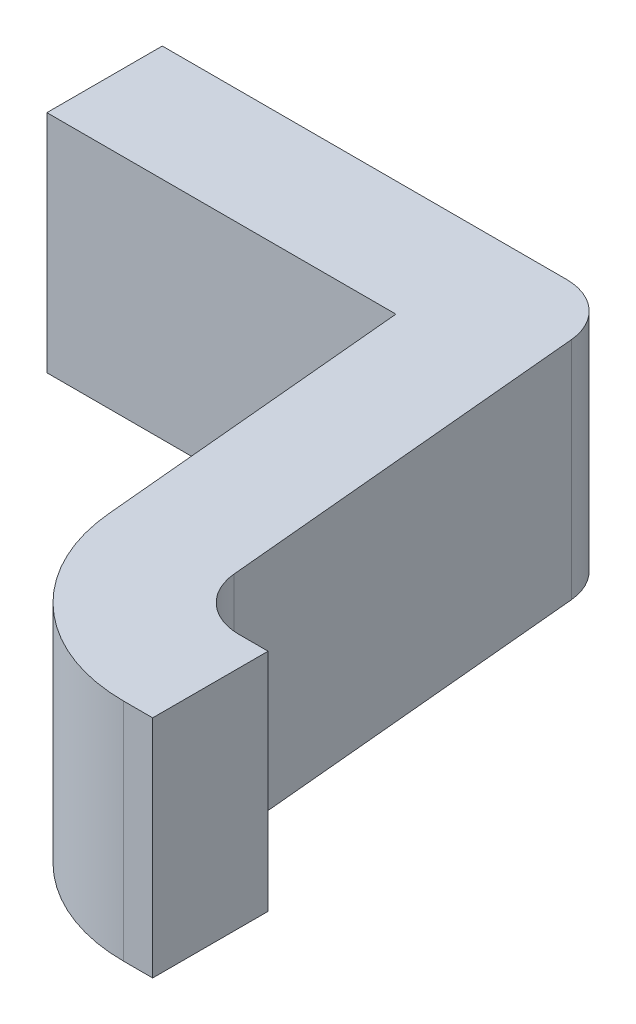
ISO-10303-21;
HEADER;
FILE_DESCRIPTION(('STEP AP214'),'2;1');
FILE_NAME('part.step','',(''),(''),'','','');
FILE_SCHEMA(('AUTOMOTIVE_DESIGN { 1 0 10303 214 1 1 1 1 }'));
ENDSEC;
DATA;
#1=APPLICATION_CONTEXT('core data for automotive mechanical design processes');
#2=APPLICATION_PROTOCOL_DEFINITION('international standard','automotive_design',2000,#1);
#3=PRODUCT_CONTEXT('',#1,'mechanical');
#4=PRODUCT('Part','Part','',(#3));
#5=PRODUCT_RELATED_PRODUCT_CATEGORY('part','',(#4));
#6=PRODUCT_DEFINITION_FORMATION('','',#4);
#7=PRODUCT_DEFINITION_CONTEXT('part definition',#1,'design');
#8=PRODUCT_DEFINITION('design','',#6,#7);
#9=PRODUCT_DEFINITION_SHAPE('','',#8);
#10=(LENGTH_UNIT() NAMED_UNIT(*) SI_UNIT(.MILLI.,.METRE.));
#11=(NAMED_UNIT(*) PLANE_ANGLE_UNIT() SI_UNIT($,.RADIAN.));
#12=(NAMED_UNIT(*) SI_UNIT($,.STERADIAN.) SOLID_ANGLE_UNIT());
#13=UNCERTAINTY_MEASURE_WITH_UNIT(LENGTH_MEASURE(1.E-05),#10,'distance_accuracy_value','');
#14=(GEOMETRIC_REPRESENTATION_CONTEXT(3) GLOBAL_UNCERTAINTY_ASSIGNED_CONTEXT((#13)) GLOBAL_UNIT_ASSIGNED_CONTEXT((#10,
#11,#12)) REPRESENTATION_CONTEXT('',''));
#15=CARTESIAN_POINT('',(0.,0.,0.));
#16=DIRECTION('',(0.,0.,1.));
#17=DIRECTION('',(1.,0.,0.));
#18=AXIS2_PLACEMENT_3D('',#15,#16,#17);
#19=CARTESIAN_POINT('',(-2.264576381953,0.840000000000001,0.21));
#20=DIRECTION('',(0.,0.,-1.));
#21=DIRECTION('',(0.,-1.,0.));
#22=AXIS2_PLACEMENT_3D('',#19,#20,#21);
#23=PLANE('',#22);
#24=DIRECTION('',(0.,1.,0.));
#25=VECTOR('',#24,1.);
#26=CARTESIAN_POINT('',(-2.364887047388,0.84,0.21));
#27=LINE('',#26,#25);
#28=CARTESIAN_POINT('',(-2.364887047388,0.429999999999999,0.21));
#29=VERTEX_POINT('',#28);
#30=CARTESIAN_POINT('',(-2.364887047388,0.84,0.21));
#31=VERTEX_POINT('',#30);
#32=EDGE_CURVE('E11',#29,#31,#27,.T.);
#33=ORIENTED_EDGE('',*,*,#32,.T.);
#34=DIRECTION('',(-1.,0.,0.));
#35=VECTOR('',#34,1.);
#36=CARTESIAN_POINT('',(-2.264576381953,0.84,0.21));
#37=LINE('',#36,#35);
#38=CARTESIAN_POINT('',(-3.,0.84,0.21));
#39=VERTEX_POINT('',#38);
#40=EDGE_CURVE('E24',#31,#39,#37,.T.);
#41=ORIENTED_EDGE('',*,*,#40,.T.);
#42=DIRECTION('',(0.,-1.,0.));
#43=VECTOR('',#42,1.);
#44=CARTESIAN_POINT('',(-3.,0.84,0.21));
#45=LINE('',#44,#43);
#46=CARTESIAN_POINT('',(-3.,0.429999999999999,0.21));
#47=VERTEX_POINT('',#46);
#48=EDGE_CURVE('E187',#39,#47,#45,.T.);
#49=ORIENTED_EDGE('',*,*,#48,.T.);
#50=DIRECTION('',(-1.,0.,0.));
#51=VECTOR('',#50,1.);
#52=CARTESIAN_POINT('',(-2.264576381953,0.429999999999999,0.21));
#53=LINE('',#52,#51);
#54=EDGE_CURVE('E184',#29,#47,#53,.T.);
#55=ORIENTED_EDGE('',*,*,#54,.F.);
#56=EDGE_LOOP('',(#33,#41,#49,#55));
#57=FACE_BOUND('',#56,.T.);
#58=ADVANCED_FACE('F17',(#57),#23,.F.);
#59=CARTESIAN_POINT('',(-2.264576381953,0.429999999999999,0.));
#60=DIRECTION('',(0.,0.,1.));
#61=DIRECTION('',(0.,1.,0.));
#62=AXIS2_PLACEMENT_3D('',#59,#60,#61);
#63=PLANE('',#62);
#64=DIRECTION('',(0.,1.,0.));
#65=VECTOR('',#64,1.);
#66=CARTESIAN_POINT('',(-2.264576381953,0.429999999999999,0.));
#67=LINE('',#66,#65);
#68=CARTESIAN_POINT('',(-2.264576381953,0.429999999999999,0.));
#69=VERTEX_POINT('',#68);
#70=CARTESIAN_POINT('',(-2.264576381953,0.84,0.));
#71=VERTEX_POINT('',#70);
#72=EDGE_CURVE('E182',#69,#71,#67,.T.);
#73=ORIENTED_EDGE('',*,*,#72,.F.);
#74=DIRECTION('',(-1.,0.,0.));
#75=VECTOR('',#74,1.);
#76=CARTESIAN_POINT('',(-2.264576381953,0.429999999999999,0.));
#77=LINE('',#76,#75);
#78=CARTESIAN_POINT('',(-3.,0.429999999999999,0.));
#79=VERTEX_POINT('',#78);
#80=EDGE_CURVE('E180',#69,#79,#77,.T.);
#81=ORIENTED_EDGE('',*,*,#80,.T.);
#82=DIRECTION('',(0.,1.,0.));
#83=VECTOR('',#82,1.);
#84=CARTESIAN_POINT('',(-3.,0.429999999999999,0.));
#85=LINE('',#84,#83);
#86=CARTESIAN_POINT('',(-3.,0.84,0.));
#87=VERTEX_POINT('',#86);
#88=EDGE_CURVE('E178',#79,#87,#85,.T.);
#89=ORIENTED_EDGE('',*,*,#88,.T.);
#90=DIRECTION('',(-1.,0.,0.));
#91=VECTOR('',#90,1.);
#92=CARTESIAN_POINT('',(-2.264576381953,0.84,0.));
#93=LINE('',#92,#91);
#94=EDGE_CURVE('E175',#71,#87,#93,.T.);
#95=ORIENTED_EDGE('',*,*,#94,.F.);
#96=EDGE_LOOP('',(#73,#81,#89,#95));
#97=FACE_BOUND('',#96,.T.);
#98=ADVANCED_FACE('F198',(#97),#63,.F.);
#99=CARTESIAN_POINT('',(-3.,0.635,0.105));
#100=DIRECTION('',(1.,0.,0.));
#101=DIRECTION('',(0.,0.,-1.));
#102=AXIS2_PLACEMENT_3D('',#99,#100,#101);
#103=PLANE('',#102);
#104=ORIENTED_EDGE('',*,*,#88,.F.);
#105=DIRECTION('',(0.,0.,-1.));
#106=VECTOR('',#105,1.);
#107=CARTESIAN_POINT('',(-3.,0.429999999999999,0.21));
#108=LINE('',#107,#106);
#109=EDGE_CURVE('E172',#47,#79,#108,.T.);
#110=ORIENTED_EDGE('',*,*,#109,.F.);
#111=ORIENTED_EDGE('',*,*,#48,.F.);
#112=DIRECTION('',(0.,0.,1.));
#113=VECTOR('',#112,1.);
#114=CARTESIAN_POINT('',(-3.,0.84,0.));
#115=LINE('',#114,#113);
#116=EDGE_CURVE('E169',#87,#39,#115,.T.);
#117=ORIENTED_EDGE('',*,*,#116,.F.);
#118=EDGE_LOOP('',(#104,#110,#111,#117));
#119=FACE_BOUND('',#118,.T.);
#120=ADVANCED_FACE('F194',(#119),#103,.F.);
#121=CARTESIAN_POINT('',(-2.311699392514,0.840000000000001,0.786003848005723));
#122=DIRECTION('',(0.995763819525196,0.,-0.091947896792656));
#123=DIRECTION('',(0.,-1.,0.));
#124=AXIS2_PLACEMENT_3D('',#121,#122,#123);
#125=PLANE('',#124);
#126=ORIENTED_EDGE('',*,*,#32,.F.);
#127=DIRECTION('',(-0.091947896792656,0.,-0.995763819525196));
#128=VECTOR('',#127,1.);
#129=CARTESIAN_POINT('',(-2.311699392514,0.429999999999999,0.786003848005723));
#130=LINE('',#129,#128);
#131=CARTESIAN_POINT('',(-2.311699392514,0.429999999999999,0.786003848005723));
#132=VERTEX_POINT('',#131);
#133=EDGE_CURVE('E166',#132,#29,#130,.T.);
#134=ORIENTED_EDGE('',*,*,#133,.F.);
#135=DIRECTION('',(0.,-1.,0.));
#136=VECTOR('',#135,1.);
#137=CARTESIAN_POINT('',(-2.311699392514,0.84,0.786003848005723));
#138=LINE('',#137,#136);
#139=CARTESIAN_POINT('',(-2.311699392514,0.84,0.786003848005723));
#140=VERTEX_POINT('',#139);
#141=EDGE_CURVE('E163',#140,#132,#138,.T.);
#142=ORIENTED_EDGE('',*,*,#141,.F.);
#143=DIRECTION('',(-0.091947896792656,0.,-0.995763819525196));
#144=VECTOR('',#143,1.);
#145=CARTESIAN_POINT('',(-2.311699392514,0.84,0.786003848005723));
#146=LINE('',#145,#144);
#147=EDGE_CURVE('E161',#140,#31,#146,.T.);
#148=ORIENTED_EDGE('',*,*,#147,.T.);
#149=EDGE_LOOP('',(#126,#134,#142,#148));
#150=FACE_BOUND('',#149,.T.);
#151=ADVANCED_FACE('F204',(#150),#125,.F.);
#152=CARTESIAN_POINT('',(-2.264576381953,0.635,0.1));
#153=DIRECTION('',(0.,1.,0.));
#154=DIRECTION('',(0.,0.,1.));
#155=AXIS2_PLACEMENT_3D('',#152,#153,#154);
#156=CYLINDRICAL_SURFACE('',#155,0.1);
#157=DIRECTION('',(0.,1.,0.));
#158=VECTOR('',#157,1.);
#159=CARTESIAN_POINT('',(-2.165,0.429999999999999,0.0908052103207345));
#160=LINE('',#159,#158);
#161=CARTESIAN_POINT('',(-2.165,0.429999999999999,0.0908052103207343));
#162=VERTEX_POINT('',#161);
#163=CARTESIAN_POINT('',(-2.165,0.84,0.0908052103207343));
#164=VERTEX_POINT('',#163);
#165=EDGE_CURVE('E159',#162,#164,#160,.T.);
#166=ORIENTED_EDGE('',*,*,#165,.F.);
#167=CARTESIAN_POINT('',(-2.264576381953,0.429999999999999,0.1));
#168=DIRECTION('',(0.,1.,0.));
#169=DIRECTION('',(0.995763819525196,0.,-0.091947896792659));
#170=AXIS2_PLACEMENT_3D('',#167,#168,#169);
#171=CIRCLE('',#170,0.1);
#172=EDGE_CURVE('E156',#162,#69,#171,.T.);
#173=ORIENTED_EDGE('',*,*,#172,.T.);
#174=ORIENTED_EDGE('',*,*,#72,.T.);
#175=CARTESIAN_POINT('',(-2.264576381953,0.840000000000001,0.1));
#176=DIRECTION('',(0.,1.,0.));
#177=DIRECTION('',(0.995763819525196,0.,-0.091947896792659));
#178=AXIS2_PLACEMENT_3D('',#175,#176,#177);
#179=CIRCLE('',#178,0.100000000000001);
#180=EDGE_CURVE('E153',#164,#71,#179,.T.);
#181=ORIENTED_EDGE('',*,*,#180,.F.);
#182=EDGE_LOOP('',(#166,#173,#174,#181));
#183=FACE_BOUND('',#182,.T.);
#184=ADVANCED_FACE('F217',(#183),#156,.T.);
#185=CARTESIAN_POINT('',(-2.102588990414,0.429999999999999,0.766694789679267));
#186=DIRECTION('',(-0.995763819525196,0.,0.091947896792656));
#187=DIRECTION('',(0.,1.,0.));
#188=AXIS2_PLACEMENT_3D('',#185,#186,#187);
#189=PLANE('',#188);
#190=DIRECTION('',(0.,1.,0.));
#191=VECTOR('',#190,1.);
#192=CARTESIAN_POINT('',(-2.102588990414,0.429999999999999,0.766694789679267));
#193=LINE('',#192,#191);
#194=CARTESIAN_POINT('',(-2.102588990414,0.429999999999999,0.766694789679267));
#195=VERTEX_POINT('',#194);
#196=CARTESIAN_POINT('',(-2.102588990414,0.84,0.766694789679267));
#197=VERTEX_POINT('',#196);
#198=EDGE_CURVE('E151',#195,#197,#193,.T.);
#199=ORIENTED_EDGE('',*,*,#198,.F.);
#200=DIRECTION('',(-0.091947896792656,0.,-0.995763819525196));
#201=VECTOR('',#200,1.);
#202=CARTESIAN_POINT('',(-2.102588990414,0.429999999999999,0.766694789679267));
#203=LINE('',#202,#201);
#204=EDGE_CURVE('E148',#195,#162,#203,.T.);
#205=ORIENTED_EDGE('',*,*,#204,.T.);
#206=ORIENTED_EDGE('',*,*,#165,.T.);
#207=DIRECTION('',(-0.091947896792656,0.,-0.995763819525196));
#208=VECTOR('',#207,1.);
#209=CARTESIAN_POINT('',(-2.102588990414,0.84,0.766694789679267));
#210=LINE('',#209,#208);
#211=EDGE_CURVE('E145',#197,#164,#210,.T.);
#212=ORIENTED_EDGE('',*,*,#211,.F.);
#213=EDGE_LOOP('',(#199,#205,#206,#212));
#214=FACE_BOUND('',#213,.T.);
#215=ADVANCED_FACE('F215',(#214),#189,.F.);
#216=CARTESIAN_POINT('',(-2.003012608461,0.635,0.7575));
#217=DIRECTION('',(0.,-1.,0.));
#218=DIRECTION('',(0.,0.,1.));
#219=AXIS2_PLACEMENT_3D('',#216,#217,#218);
#220=CYLINDRICAL_SURFACE('',#219,0.309999999999999);
#221=DIRECTION('',(0.,-1.,0.));
#222=VECTOR('',#221,1.);
#223=CARTESIAN_POINT('',(-2.003012608461,0.84,1.0675));
#224=LINE('',#223,#222);
#225=CARTESIAN_POINT('',(-2.003012608461,0.84,1.0675));
#226=VERTEX_POINT('',#225);
#227=CARTESIAN_POINT('',(-2.003012608461,0.429999999999999,1.0675));
#228=VERTEX_POINT('',#227);
#229=EDGE_CURVE('E143',#226,#228,#224,.T.);
#230=ORIENTED_EDGE('',*,*,#229,.F.);
#231=CARTESIAN_POINT('',(-2.003012608461,0.840000000000001,0.7575));
#232=DIRECTION('',(0.,-1.,0.));
#233=DIRECTION('',(0.,0.,1.));
#234=AXIS2_PLACEMENT_3D('',#231,#232,#233);
#235=CIRCLE('',#234,0.309999999999999);
#236=EDGE_CURVE('E140',#226,#140,#235,.T.);
#237=ORIENTED_EDGE('',*,*,#236,.T.);
#238=ORIENTED_EDGE('',*,*,#141,.T.);
#239=CARTESIAN_POINT('',(-2.003012608461,0.429999999999999,0.7575));
#240=DIRECTION('',(0.,-1.,0.));
#241=DIRECTION('',(0.,0.,1.));
#242=AXIS2_PLACEMENT_3D('',#239,#240,#241);
#243=CIRCLE('',#242,0.309999999999999);
#244=EDGE_CURVE('E137',#228,#132,#243,.T.);
#245=ORIENTED_EDGE('',*,*,#244,.F.);
#246=EDGE_LOOP('',(#230,#237,#238,#245));
#247=FACE_BOUND('',#246,.T.);
#248=ADVANCED_FACE('F206',(#247),#220,.T.);
#249=CARTESIAN_POINT('',(-2.003012608461,0.635,0.7575));
#250=DIRECTION('',(0.,-1.,0.));
#251=DIRECTION('',(0.,0.,1.));
#252=AXIS2_PLACEMENT_3D('',#249,#250,#251);
#253=CYLINDRICAL_SURFACE('',#252,0.1);
#254=DIRECTION('',(0.,1.,0.));
#255=VECTOR('',#254,1.);
#256=CARTESIAN_POINT('',(-2.003012608461,0.429999999999999,0.857499999999999));
#257=LINE('',#256,#255);
#258=CARTESIAN_POINT('',(-2.003012608461,0.429999999999999,0.857499999999999));
#259=VERTEX_POINT('',#258);
#260=CARTESIAN_POINT('',(-2.003012608461,0.84,0.857499999999999));
#261=VERTEX_POINT('',#260);
#262=EDGE_CURVE('E115',#259,#261,#257,.T.);
#263=ORIENTED_EDGE('',*,*,#262,.F.);
#264=CARTESIAN_POINT('',(-2.003012608461,0.429999999999999,0.7575));
#265=DIRECTION('',(0.,-1.,0.));
#266=DIRECTION('',(0.,0.,1.));
#267=AXIS2_PLACEMENT_3D('',#264,#265,#266);
#268=CIRCLE('',#267,0.1);
#269=EDGE_CURVE('E133',#259,#195,#268,.T.);
#270=ORIENTED_EDGE('',*,*,#269,.T.);
#271=ORIENTED_EDGE('',*,*,#198,.T.);
#272=CARTESIAN_POINT('',(-2.003012608461,0.840000000000001,0.7575));
#273=DIRECTION('',(0.,-1.,0.));
#274=DIRECTION('',(0.,0.,1.));
#275=AXIS2_PLACEMENT_3D('',#272,#273,#274);
#276=CIRCLE('',#275,0.0999999999999998);
#277=EDGE_CURVE('E131',#261,#197,#276,.T.);
#278=ORIENTED_EDGE('',*,*,#277,.F.);
#279=EDGE_LOOP('',(#263,#270,#271,#278));
#280=FACE_BOUND('',#279,.T.);
#281=ADVANCED_FACE('F212',(#280),#253,.F.);
#282=CARTESIAN_POINT('',(-1.95,0.429999999999999,1.0675));
#283=DIRECTION('',(0.,1.,0.));
#284=DIRECTION('',(0.,0.,-1.));
#285=AXIS2_PLACEMENT_3D('',#282,#283,#284);
#286=PLANE('',#285);
#287=DIRECTION('',(0.,0.,-1.));
#288=VECTOR('',#287,1.);
#289=CARTESIAN_POINT('',(-1.95,0.429999999999999,1.0675));
#290=LINE('',#289,#288);
#291=CARTESIAN_POINT('',(-1.95,0.429999999999999,1.0675));
#292=VERTEX_POINT('',#291);
#293=CARTESIAN_POINT('',(-1.95,0.429999999999999,0.857499999999999));
#294=VERTEX_POINT('',#293);
#295=EDGE_CURVE('E118',#292,#294,#290,.T.);
#296=ORIENTED_EDGE('',*,*,#295,.F.);
#297=DIRECTION('',(-1.,0.,0.));
#298=VECTOR('',#297,1.);
#299=CARTESIAN_POINT('',(-1.95,0.429999999999999,1.0675));
#300=LINE('',#299,#298);
#301=EDGE_CURVE('E127',#292,#228,#300,.T.);
#302=ORIENTED_EDGE('',*,*,#301,.T.);
#303=ORIENTED_EDGE('',*,*,#244,.T.);
#304=ORIENTED_EDGE('',*,*,#133,.T.);
#305=ORIENTED_EDGE('',*,*,#54,.T.);
#306=ORIENTED_EDGE('',*,*,#109,.T.);
#307=ORIENTED_EDGE('',*,*,#80,.F.);
#308=ORIENTED_EDGE('',*,*,#172,.F.);
#309=ORIENTED_EDGE('',*,*,#204,.F.);
#310=ORIENTED_EDGE('',*,*,#269,.F.);
#311=DIRECTION('',(-1.,0.,0.));
#312=VECTOR('',#311,1.);
#313=CARTESIAN_POINT('',(-1.95,0.429999999999999,0.857499999999999));
#314=LINE('',#313,#312);
#315=EDGE_CURVE('E125',#294,#259,#314,.T.);
#316=ORIENTED_EDGE('',*,*,#315,.F.);
#317=EDGE_LOOP('',(#296,#302,#303,#304,#305,#306,#307,#308,#309,#310,#316));
#318=FACE_BOUND('',#317,.T.);
#319=ADVANCED_FACE('F201',(#318),#286,.F.);
#320=CARTESIAN_POINT('',(-1.95,0.840000000000001,1.0675));
#321=DIRECTION('',(0.,0.,-1.));
#322=DIRECTION('',(0.,-1.,0.));
#323=AXIS2_PLACEMENT_3D('',#320,#321,#322);
#324=PLANE('',#323);
#325=DIRECTION('',(0.,-1.,0.));
#326=VECTOR('',#325,1.);
#327=CARTESIAN_POINT('',(-1.95,0.84,1.0675));
#328=LINE('',#327,#326);
#329=CARTESIAN_POINT('',(-1.95,0.84,1.0675));
#330=VERTEX_POINT('',#329);
#331=EDGE_CURVE('E123',#330,#292,#328,.T.);
#332=ORIENTED_EDGE('',*,*,#331,.F.);
#333=DIRECTION('',(-1.,0.,0.));
#334=VECTOR('',#333,1.);
#335=CARTESIAN_POINT('',(-1.95,0.84,1.0675));
#336=LINE('',#335,#334);
#337=EDGE_CURVE('E103',#330,#226,#336,.T.);
#338=ORIENTED_EDGE('',*,*,#337,.T.);
#339=ORIENTED_EDGE('',*,*,#229,.T.);
#340=ORIENTED_EDGE('',*,*,#301,.F.);
#341=EDGE_LOOP('',(#332,#338,#339,#340));
#342=FACE_BOUND('',#341,.T.);
#343=ADVANCED_FACE('F208',(#342),#324,.F.);
#344=CARTESIAN_POINT('',(-1.95,0.840000000000001,0.857499999999999));
#345=DIRECTION('',(0.,-1.,0.));
#346=DIRECTION('',(0.,0.,1.));
#347=AXIS2_PLACEMENT_3D('',#344,#345,#346);
#348=PLANE('',#347);
#349=DIRECTION('',(0.,0.,1.));
#350=VECTOR('',#349,1.);
#351=CARTESIAN_POINT('',(-1.95,0.84,0.857499999999999));
#352=LINE('',#351,#350);
#353=CARTESIAN_POINT('',(-1.95,0.84,0.857499999999999));
#354=VERTEX_POINT('',#353);
#355=EDGE_CURVE('E96',#354,#330,#352,.T.);
#356=ORIENTED_EDGE('',*,*,#355,.F.);
#357=DIRECTION('',(-1.,0.,0.));
#358=VECTOR('',#357,1.);
#359=CARTESIAN_POINT('',(-1.95,0.84,0.857499999999999));
#360=LINE('',#359,#358);
#361=EDGE_CURVE('E100',#354,#261,#360,.T.);
#362=ORIENTED_EDGE('',*,*,#361,.T.);
#363=ORIENTED_EDGE('',*,*,#277,.T.);
#364=ORIENTED_EDGE('',*,*,#211,.T.);
#365=ORIENTED_EDGE('',*,*,#180,.T.);
#366=ORIENTED_EDGE('',*,*,#94,.T.);
#367=ORIENTED_EDGE('',*,*,#116,.T.);
#368=ORIENTED_EDGE('',*,*,#40,.F.);
#369=ORIENTED_EDGE('',*,*,#147,.F.);
#370=ORIENTED_EDGE('',*,*,#236,.F.);
#371=ORIENTED_EDGE('',*,*,#337,.F.);
#372=EDGE_LOOP('',(#356,#362,#363,#364,#365,#366,#367,#368,#369,#370,#371));
#373=FACE_BOUND('',#372,.T.);
#374=ADVANCED_FACE('F98',(#373),#348,.F.);
#375=CARTESIAN_POINT('',(-1.95,0.429999999999999,0.857499999999999));
#376=DIRECTION('',(0.,0.,1.));
#377=DIRECTION('',(0.,1.,0.));
#378=AXIS2_PLACEMENT_3D('',#375,#376,#377);
#379=PLANE('',#378);
#380=DIRECTION('',(0.,1.,0.));
#381=VECTOR('',#380,1.);
#382=CARTESIAN_POINT('',(-1.95,0.429999999999999,0.857499999999999));
#383=LINE('',#382,#381);
#384=EDGE_CURVE('E113',#294,#354,#383,.T.);
#385=ORIENTED_EDGE('',*,*,#384,.F.);
#386=ORIENTED_EDGE('',*,*,#315,.T.);
#387=ORIENTED_EDGE('',*,*,#262,.T.);
#388=ORIENTED_EDGE('',*,*,#361,.F.);
#389=EDGE_LOOP('',(#385,#386,#387,#388));
#390=FACE_BOUND('',#389,.T.);
#391=ADVANCED_FACE('F111',(#390),#379,.F.);
#392=CARTESIAN_POINT('',(-1.95,0.635,0.962500000000001));
#393=DIRECTION('',(1.,0.,0.));
#394=DIRECTION('',(0.,0.,-1.));
#395=AXIS2_PLACEMENT_3D('',#392,#393,#394);
#396=PLANE('',#395);
#397=ORIENTED_EDGE('',*,*,#384,.T.);
#398=ORIENTED_EDGE('',*,*,#355,.T.);
#399=ORIENTED_EDGE('',*,*,#331,.T.);
#400=ORIENTED_EDGE('',*,*,#295,.T.);
#401=EDGE_LOOP('',(#397,#398,#399,#400));
#402=FACE_BOUND('',#401,.T.);
#403=ADVANCED_FACE('F117',(#402),#396,.T.);
#404=CLOSED_SHELL('',(#58,#98,#120,#151,#184,#215,#248,#281,#319,#343,#374,#391,#403));
#405=MANIFOLD_SOLID_BREP('B1',#404);
#406=ADVANCED_BREP_SHAPE_REPRESENTATION('',(#18,#405),#14);
#407=SHAPE_DEFINITION_REPRESENTATION(#9,#406);
ENDSEC;
END-ISO-10303-21;
